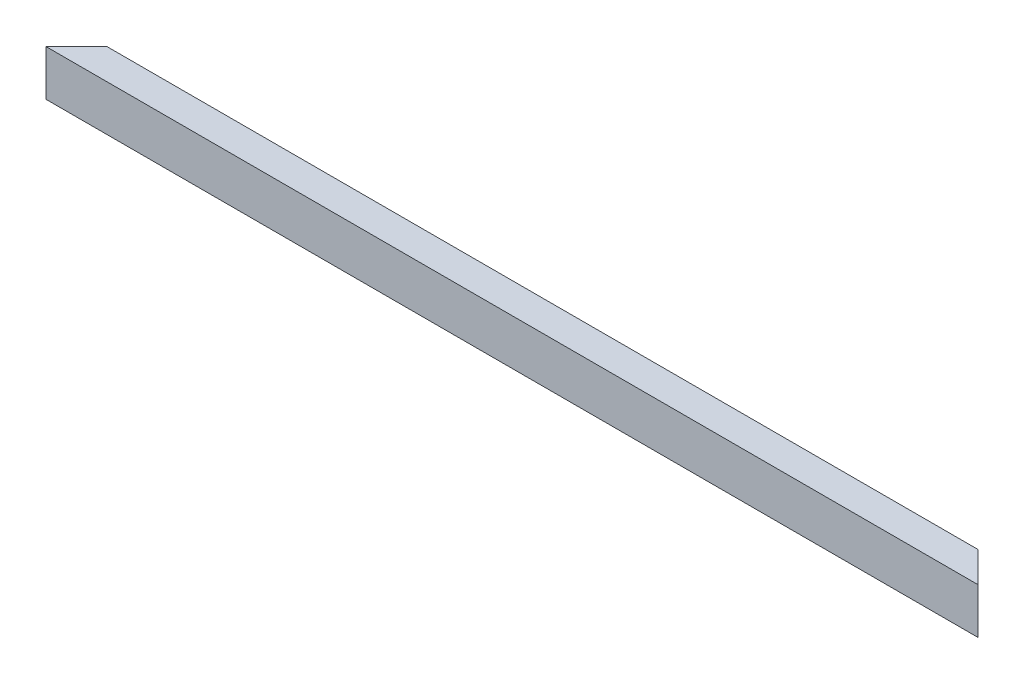
ISO-10303-21;
HEADER;
FILE_DESCRIPTION(('STEP AP214'),'2;1');
FILE_NAME('part.step','',(''),(''),'','','');
FILE_SCHEMA(('AUTOMOTIVE_DESIGN { 1 0 10303 214 1 1 1 1 }'));
ENDSEC;
DATA;
#1=APPLICATION_CONTEXT('core data for automotive mechanical design processes');
#2=APPLICATION_PROTOCOL_DEFINITION('international standard','automotive_design',2000,#1);
#3=PRODUCT_CONTEXT('',#1,'mechanical');
#4=PRODUCT('Part','Part','',(#3));
#5=PRODUCT_RELATED_PRODUCT_CATEGORY('part','',(#4));
#6=PRODUCT_DEFINITION_FORMATION('','',#4);
#7=PRODUCT_DEFINITION_CONTEXT('part definition',#1,'design');
#8=PRODUCT_DEFINITION('design','',#6,#7);
#9=PRODUCT_DEFINITION_SHAPE('','',#8);
#10=(LENGTH_UNIT() NAMED_UNIT(*) SI_UNIT(.MILLI.,.METRE.));
#11=(NAMED_UNIT(*) PLANE_ANGLE_UNIT() SI_UNIT($,.RADIAN.));
#12=(NAMED_UNIT(*) SI_UNIT($,.STERADIAN.) SOLID_ANGLE_UNIT());
#13=UNCERTAINTY_MEASURE_WITH_UNIT(LENGTH_MEASURE(1.E-05),#10,'distance_accuracy_value','');
#14=(GEOMETRIC_REPRESENTATION_CONTEXT(3) GLOBAL_UNCERTAINTY_ASSIGNED_CONTEXT((#13)) GLOBAL_UNIT_ASSIGNED_CONTEXT((#10,
#11,#12)) REPRESENTATION_CONTEXT('',''));
#15=CARTESIAN_POINT('',(0.,0.,0.));
#16=DIRECTION('',(0.,0.,1.));
#17=DIRECTION('',(1.,0.,0.));
#18=AXIS2_PLACEMENT_3D('',#15,#16,#17);
#19=CARTESIAN_POINT('',(0.,18.,0.));
#20=DIRECTION('',(0.,0.,-1.));
#21=DIRECTION('',(-1.,0.,0.));
#22=AXIS2_PLACEMENT_3D('',#19,#20,#21);
#23=PLANE('',#22);
#24=DIRECTION('',(0.,-1.,0.));
#25=VECTOR('',#24,1.);
#26=CARTESIAN_POINT('',(-171.5,18.,0.));
#27=LINE('',#26,#25);
#28=CARTESIAN_POINT('',(-171.5,13.0000000000001,0.));
#29=VERTEX_POINT('',#28);
#30=CARTESIAN_POINT('',(-171.5,0.,0.));
#31=VERTEX_POINT('',#30);
#32=EDGE_CURVE('E127',#29,#31,#27,.T.);
#33=ORIENTED_EDGE('',*,*,#32,.F.);
#34=DIRECTION('',(1.,0.,0.));
#35=VECTOR('',#34,1.);
#36=CARTESIAN_POINT('',(0.,13.,0.));
#37=LINE('',#36,#35);
#38=CARTESIAN_POINT('',(171.5,13.,0.));
#39=VERTEX_POINT('',#38);
#40=EDGE_CURVE('E114',#29,#39,#37,.T.);
#41=ORIENTED_EDGE('',*,*,#40,.T.);
#42=DIRECTION('',(0.,-1.,0.));
#43=VECTOR('',#42,1.);
#44=CARTESIAN_POINT('',(171.5,18.,0.));
#45=LINE('',#44,#43);
#46=CARTESIAN_POINT('',(171.5,0.,0.));
#47=VERTEX_POINT('',#46);
#48=EDGE_CURVE('E85',#39,#47,#45,.T.);
#49=ORIENTED_EDGE('',*,*,#48,.T.);
#50=DIRECTION('',(1.,0.,0.));
#51=VECTOR('',#50,1.);
#52=CARTESIAN_POINT('',(0.,0.,0.));
#53=LINE('',#52,#51);
#54=EDGE_CURVE('E131',#31,#47,#53,.T.);
#55=ORIENTED_EDGE('',*,*,#54,.F.);
#56=EDGE_LOOP('',(#33,#41,#49,#55));
#57=FACE_BOUND('',#56,.T.);
#58=ADVANCED_FACE('F38',(#57),#23,.T.);
#59=CARTESIAN_POINT('',(-85.7499999999977,18.,-85.75));
#60=DIRECTION('',(0.707106781186538,0.,0.707106781186557));
#61=DIRECTION('',(0.707106781186557,0.,-0.707106781186538));
#62=AXIS2_PLACEMENT_3D('',#59,#60,#61);
#63=PLANE('',#62);
#64=DIRECTION('',(-0.707106781186557,0.,0.707106781186538));
#65=VECTOR('',#64,1.);
#66=CARTESIAN_POINT('',(-85.7499999999977,13.,-85.75));
#67=LINE('',#66,#65);
#68=CARTESIAN_POINT('',(-174.5,13.0000000000001,3.));
#69=VERTEX_POINT('',#68);
#70=EDGE_CURVE('E118',#29,#69,#67,.T.);
#71=ORIENTED_EDGE('',*,*,#70,.F.);
#72=ORIENTED_EDGE('',*,*,#32,.T.);
#73=DIRECTION('',(-0.707106781186557,0.,0.707106781186538));
#74=VECTOR('',#73,1.);
#75=CARTESIAN_POINT('',(-85.7499999999977,0.,-85.75));
#76=LINE('',#75,#74);
#77=CARTESIAN_POINT('',(-183.5,0.,12.));
#78=VERTEX_POINT('',#77);
#79=EDGE_CURVE('E164',#31,#78,#76,.T.);
#80=ORIENTED_EDGE('',*,*,#79,.T.);
#81=DIRECTION('',(0.,-1.,0.));
#82=VECTOR('',#81,1.);
#83=CARTESIAN_POINT('',(-183.5,18.,12.));
#84=LINE('',#83,#82);
#85=CARTESIAN_POINT('',(-183.5,18.,12.));
#86=VERTEX_POINT('',#85);
#87=EDGE_CURVE('E134',#86,#78,#84,.T.);
#88=ORIENTED_EDGE('',*,*,#87,.F.);
#89=DIRECTION('',(-0.707106781186557,0.,0.707106781186538));
#90=VECTOR('',#89,1.);
#91=CARTESIAN_POINT('',(-85.7499999999977,18.,-85.75));
#92=LINE('',#91,#90);
#93=CARTESIAN_POINT('',(-171.5,18.,0.));
#94=VERTEX_POINT('',#93);
#95=EDGE_CURVE('E155',#94,#86,#92,.T.);
#96=ORIENTED_EDGE('',*,*,#95,.F.);
#97=CARTESIAN_POINT('',(-171.5,15.,0.));
#98=VERTEX_POINT('',#97);
#99=EDGE_CURVE('E92',#94,#98,#27,.T.);
#100=ORIENTED_EDGE('',*,*,#99,.T.);
#101=DIRECTION('',(-0.707106781186557,0.,0.707106781186538));
#102=VECTOR('',#101,1.);
#103=CARTESIAN_POINT('',(-85.7499999999977,15.,-85.75));
#104=LINE('',#103,#102);
#105=CARTESIAN_POINT('',(-174.5,15.,3.));
#106=VERTEX_POINT('',#105);
#107=EDGE_CURVE('E132',#98,#106,#104,.T.);
#108=ORIENTED_EDGE('',*,*,#107,.T.);
#109=DIRECTION('',(0.,1.,0.));
#110=VECTOR('',#109,1.);
#111=CARTESIAN_POINT('',(-174.5,18.,3.));
#112=LINE('',#111,#110);
#113=EDGE_CURVE('E130',#69,#106,#112,.T.);
#114=ORIENTED_EDGE('',*,*,#113,.F.);
#115=EDGE_LOOP('',(#71,#72,#80,#88,#96,#100,#108,#114));
#116=FACE_BOUND('',#115,.T.);
#117=ADVANCED_FACE('F125',(#116),#63,.F.);
#118=CARTESIAN_POINT('',(85.7499999999977,18.,-85.75));
#119=DIRECTION('',(0.707106781186538,0.,-0.707106781186557));
#120=DIRECTION('',(-0.707106781186557,0.,-0.707106781186538));
#121=AXIS2_PLACEMENT_3D('',#118,#119,#120);
#122=PLANE('',#121);
#123=ORIENTED_EDGE('',*,*,#48,.F.);
#124=DIRECTION('',(0.707106781186557,0.,0.707106781186538));
#125=VECTOR('',#124,1.);
#126=CARTESIAN_POINT('',(85.7499999999977,13.,-85.75));
#127=LINE('',#126,#125);
#128=CARTESIAN_POINT('',(174.5,13.,3.));
#129=VERTEX_POINT('',#128);
#130=EDGE_CURVE('E11',#39,#129,#127,.T.);
#131=ORIENTED_EDGE('',*,*,#130,.T.);
#132=DIRECTION('',(0.,1.,0.));
#133=VECTOR('',#132,1.);
#134=CARTESIAN_POINT('',(174.5,18.,3.));
#135=LINE('',#134,#133);
#136=CARTESIAN_POINT('',(174.5,15.,3.));
#137=VERTEX_POINT('',#136);
#138=EDGE_CURVE('E136',#129,#137,#135,.T.);
#139=ORIENTED_EDGE('',*,*,#138,.T.);
#140=DIRECTION('',(0.707106781186557,0.,0.707106781186538));
#141=VECTOR('',#140,1.);
#142=CARTESIAN_POINT('',(85.7499999999977,15.,-85.75));
#143=LINE('',#142,#141);
#144=CARTESIAN_POINT('',(171.5,15.,0.));
#145=VERTEX_POINT('',#144);
#146=EDGE_CURVE('E46',#145,#137,#143,.T.);
#147=ORIENTED_EDGE('',*,*,#146,.F.);
#148=CARTESIAN_POINT('',(171.5,18.,0.));
#149=VERTEX_POINT('',#148);
#150=EDGE_CURVE('E62',#149,#145,#45,.T.);
#151=ORIENTED_EDGE('',*,*,#150,.F.);
#152=DIRECTION('',(0.707106781186557,0.,0.707106781186538));
#153=VECTOR('',#152,1.);
#154=CARTESIAN_POINT('',(85.7499999999977,18.,-85.75));
#155=LINE('',#154,#153);
#156=CARTESIAN_POINT('',(183.5,18.,12.));
#157=VERTEX_POINT('',#156);
#158=EDGE_CURVE('E161',#149,#157,#155,.T.);
#159=ORIENTED_EDGE('',*,*,#158,.T.);
#160=DIRECTION('',(0.,-1.,0.));
#161=VECTOR('',#160,1.);
#162=CARTESIAN_POINT('',(183.5,18.,12.));
#163=LINE('',#162,#161);
#164=CARTESIAN_POINT('',(183.5,0.,12.));
#165=VERTEX_POINT('',#164);
#166=EDGE_CURVE('E137',#157,#165,#163,.T.);
#167=ORIENTED_EDGE('',*,*,#166,.T.);
#168=DIRECTION('',(0.707106781186557,0.,0.707106781186538));
#169=VECTOR('',#168,1.);
#170=CARTESIAN_POINT('',(85.7499999999977,0.,-85.75));
#171=LINE('',#170,#169);
#172=EDGE_CURVE('E156',#47,#165,#171,.T.);
#173=ORIENTED_EDGE('',*,*,#172,.F.);
#174=EDGE_LOOP('',(#123,#131,#139,#147,#151,#159,#167,#173));
#175=FACE_BOUND('',#174,.T.);
#176=ADVANCED_FACE('F144',(#175),#122,.T.);
#177=DIRECTION('',(1.,0.,0.));
#178=VECTOR('',#177,1.);
#179=CARTESIAN_POINT('',(0.,15.,0.));
#180=LINE('',#179,#178);
#181=EDGE_CURVE('E121',#98,#145,#180,.T.);
#182=ORIENTED_EDGE('',*,*,#181,.F.);
#183=ORIENTED_EDGE('',*,*,#99,.F.);
#184=DIRECTION('',(1.,0.,0.));
#185=VECTOR('',#184,1.);
#186=CARTESIAN_POINT('',(0.,18.,0.));
#187=LINE('',#186,#185);
#188=EDGE_CURVE('E153',#94,#149,#187,.T.);
#189=ORIENTED_EDGE('',*,*,#188,.T.);
#190=ORIENTED_EDGE('',*,*,#150,.T.);
#191=EDGE_LOOP('',(#182,#183,#189,#190));
#192=FACE_BOUND('',#191,.T.);
#193=ADVANCED_FACE('F40',(#192),#23,.T.);
#194=CARTESIAN_POINT('',(0.,18.,12.));
#195=DIRECTION('',(0.,0.,1.));
#196=DIRECTION('',(1.,0.,0.));
#197=AXIS2_PLACEMENT_3D('',#194,#195,#196);
#198=PLANE('',#197);
#199=DIRECTION('',(-1.,0.,0.));
#200=VECTOR('',#199,1.);
#201=CARTESIAN_POINT('',(0.,0.,12.));
#202=LINE('',#201,#200);
#203=EDGE_CURVE('E166',#165,#78,#202,.T.);
#204=ORIENTED_EDGE('',*,*,#203,.F.);
#205=ORIENTED_EDGE('',*,*,#166,.F.);
#206=DIRECTION('',(-1.,0.,0.));
#207=VECTOR('',#206,1.);
#208=CARTESIAN_POINT('',(0.,18.,12.));
#209=LINE('',#208,#207);
#210=EDGE_CURVE('E158',#157,#86,#209,.T.);
#211=ORIENTED_EDGE('',*,*,#210,.T.);
#212=ORIENTED_EDGE('',*,*,#87,.T.);
#213=EDGE_LOOP('',(#204,#205,#211,#212));
#214=FACE_BOUND('',#213,.T.);
#215=ADVANCED_FACE('F176',(#214),#198,.T.);
#216=CARTESIAN_POINT('',(0.,18.,0.));
#217=DIRECTION('',(0.,1.,0.));
#218=DIRECTION('',(0.,0.,1.));
#219=AXIS2_PLACEMENT_3D('',#216,#217,#218);
#220=PLANE('',#219);
#221=ORIENTED_EDGE('',*,*,#188,.F.);
#222=ORIENTED_EDGE('',*,*,#95,.T.);
#223=ORIENTED_EDGE('',*,*,#210,.F.);
#224=ORIENTED_EDGE('',*,*,#158,.F.);
#225=EDGE_LOOP('',(#221,#222,#223,#224));
#226=FACE_BOUND('',#225,.T.);
#227=ADVANCED_FACE('F182',(#226),#220,.T.);
#228=CARTESIAN_POINT('',(0.,0.,0.));
#229=DIRECTION('',(0.,1.,0.));
#230=DIRECTION('',(0.,0.,1.));
#231=AXIS2_PLACEMENT_3D('',#228,#229,#230);
#232=PLANE('',#231);
#233=ORIENTED_EDGE('',*,*,#54,.T.);
#234=ORIENTED_EDGE('',*,*,#172,.T.);
#235=ORIENTED_EDGE('',*,*,#203,.T.);
#236=ORIENTED_EDGE('',*,*,#79,.F.);
#237=EDGE_LOOP('',(#233,#234,#235,#236));
#238=FACE_BOUND('',#237,.T.);
#239=ADVANCED_FACE('F179',(#238),#232,.F.);
#240=CARTESIAN_POINT('',(0.,13.,3.));
#241=DIRECTION('',(0.,1.,0.));
#242=DIRECTION('',(-1.,0.,0.));
#243=AXIS2_PLACEMENT_3D('',#240,#241,#242);
#244=PLANE('',#243);
#245=ORIENTED_EDGE('',*,*,#70,.T.);
#246=DIRECTION('',(1.,0.,0.));
#247=VECTOR('',#246,1.);
#248=CARTESIAN_POINT('',(0.,13.,3.));
#249=LINE('',#248,#247);
#250=EDGE_CURVE('E146',#69,#129,#249,.T.);
#251=ORIENTED_EDGE('',*,*,#250,.T.);
#252=ORIENTED_EDGE('',*,*,#130,.F.);
#253=ORIENTED_EDGE('',*,*,#40,.F.);
#254=EDGE_LOOP('',(#245,#251,#252,#253));
#255=FACE_BOUND('',#254,.T.);
#256=ADVANCED_FACE('F116',(#255),#244,.T.);
#257=CARTESIAN_POINT('',(0.,15.,3.));
#258=DIRECTION('',(0.,1.,0.));
#259=DIRECTION('',(0.,0.,1.));
#260=AXIS2_PLACEMENT_3D('',#257,#258,#259);
#261=PLANE('',#260);
#262=ORIENTED_EDGE('',*,*,#181,.T.);
#263=ORIENTED_EDGE('',*,*,#146,.T.);
#264=DIRECTION('',(1.,0.,0.));
#265=VECTOR('',#264,1.);
#266=CARTESIAN_POINT('',(0.,15.,3.));
#267=LINE('',#266,#265);
#268=EDGE_CURVE('E53',#106,#137,#267,.T.);
#269=ORIENTED_EDGE('',*,*,#268,.F.);
#270=ORIENTED_EDGE('',*,*,#107,.F.);
#271=EDGE_LOOP('',(#262,#263,#269,#270));
#272=FACE_BOUND('',#271,.T.);
#273=ADVANCED_FACE('F143',(#272),#261,.F.);
#274=CARTESIAN_POINT('',(0.,0.,3.));
#275=DIRECTION('',(0.,0.,-1.));
#276=DIRECTION('',(-1.,0.,0.));
#277=AXIS2_PLACEMENT_3D('',#274,#275,#276);
#278=PLANE('',#277);
#279=ORIENTED_EDGE('',*,*,#113,.T.);
#280=ORIENTED_EDGE('',*,*,#268,.T.);
#281=ORIENTED_EDGE('',*,*,#138,.F.);
#282=ORIENTED_EDGE('',*,*,#250,.F.);
#283=EDGE_LOOP('',(#279,#280,#281,#282));
#284=FACE_BOUND('',#283,.T.);
#285=ADVANCED_FACE('F145',(#284),#278,.T.);
#286=CLOSED_SHELL('',(#58,#117,#176,#193,#215,#227,#239,#256,#273,#285));
#287=MANIFOLD_SOLID_BREP('B2',#286);
#288=ADVANCED_BREP_SHAPE_REPRESENTATION('',(#18,#287),#14);
#289=SHAPE_DEFINITION_REPRESENTATION(#9,#288);
ENDSEC;
END-ISO-10303-21;
